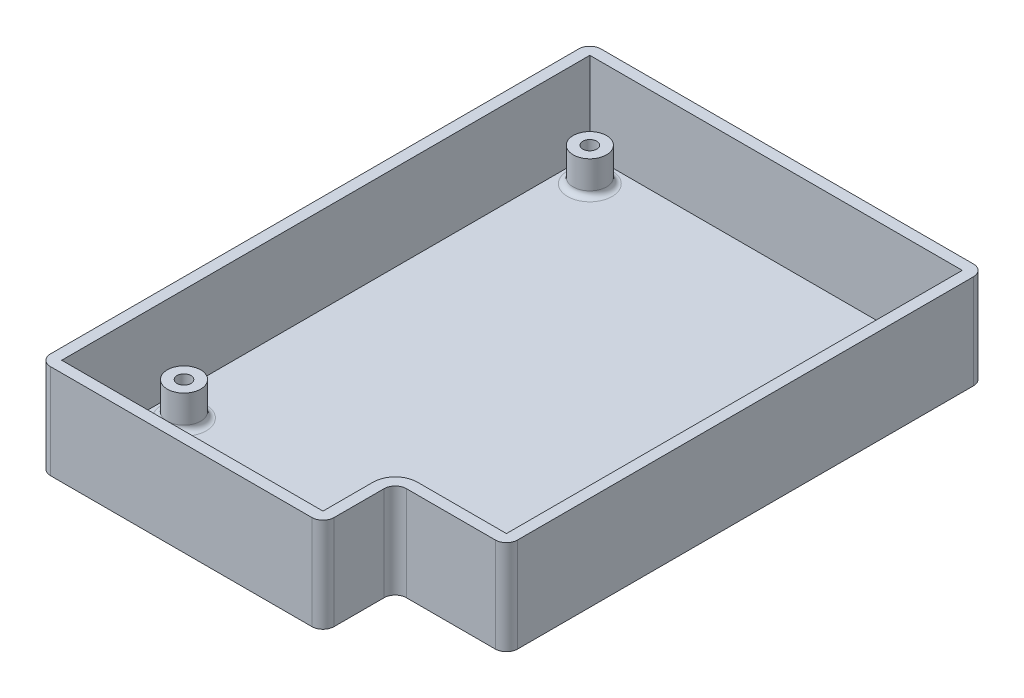
ISO-10303-21;
HEADER;
FILE_DESCRIPTION(('STEP AP214'),'2;1');
FILE_NAME('part.step','',(''),(''),'','','');
FILE_SCHEMA(('AUTOMOTIVE_DESIGN { 1 0 10303 214 1 1 1 1 }'));
ENDSEC;
DATA;
#1=APPLICATION_CONTEXT('core data for automotive mechanical design processes');
#2=APPLICATION_PROTOCOL_DEFINITION('international standard','automotive_design',2000,#1);
#3=PRODUCT_CONTEXT('',#1,'mechanical');
#4=PRODUCT('Part','Part','',(#3));
#5=PRODUCT_RELATED_PRODUCT_CATEGORY('part','',(#4));
#6=PRODUCT_DEFINITION_FORMATION('','',#4);
#7=PRODUCT_DEFINITION_CONTEXT('part definition',#1,'design');
#8=PRODUCT_DEFINITION('design','',#6,#7);
#9=PRODUCT_DEFINITION_SHAPE('','',#8);
#10=(LENGTH_UNIT() NAMED_UNIT(*) SI_UNIT(.MILLI.,.METRE.));
#11=(NAMED_UNIT(*) PLANE_ANGLE_UNIT() SI_UNIT($,.RADIAN.));
#12=(NAMED_UNIT(*) SI_UNIT($,.STERADIAN.) SOLID_ANGLE_UNIT());
#13=UNCERTAINTY_MEASURE_WITH_UNIT(LENGTH_MEASURE(1.E-05),#10,'distance_accuracy_value','');
#14=(GEOMETRIC_REPRESENTATION_CONTEXT(3) GLOBAL_UNCERTAINTY_ASSIGNED_CONTEXT((#13)) GLOBAL_UNIT_ASSIGNED_CONTEXT((#10,
#11,#12)) REPRESENTATION_CONTEXT('',''));
#15=CARTESIAN_POINT('',(0.,0.,0.));
#16=DIRECTION('',(0.,0.,1.));
#17=DIRECTION('',(1.,0.,0.));
#18=AXIS2_PLACEMENT_3D('',#15,#16,#17);
#19=CARTESIAN_POINT('',(0.,1.5,0.));
#20=DIRECTION('',(0.,1.,0.));
#21=DIRECTION('',(0.,0.,1.));
#22=AXIS2_PLACEMENT_3D('',#19,#20,#21);
#23=PLANE('',#22);
#24=DIRECTION('',(-1.,0.,0.));
#25=VECTOR('',#24,1.);
#26=CARTESIAN_POINT('',(33.5,1.5,-41.));
#27=LINE('',#26,#25);
#28=CARTESIAN_POINT('',(33.5,1.5,-41.));
#29=VERTEX_POINT('',#28);
#30=CARTESIAN_POINT('',(-33.5,1.5,-41.));
#31=VERTEX_POINT('',#30);
#32=EDGE_CURVE('E203',#29,#31,#27,.T.);
#33=ORIENTED_EDGE('',*,*,#32,.T.);
#34=DIRECTION('',(0.,0.,1.));
#35=VECTOR('',#34,1.);
#36=CARTESIAN_POINT('',(-33.5,1.5,-41.));
#37=LINE('',#36,#35);
#38=CARTESIAN_POINT('',(-33.5,1.5,54.));
#39=VERTEX_POINT('',#38);
#40=EDGE_CURVE('E185',#31,#39,#37,.T.);
#41=ORIENTED_EDGE('',*,*,#40,.T.);
#42=DIRECTION('',(1.,0.,0.));
#43=VECTOR('',#42,1.);
#44=CARTESIAN_POINT('',(-33.5,1.5,54.));
#45=LINE('',#44,#43);
#46=CARTESIAN_POINT('',(13.5,1.5,54.));
#47=VERTEX_POINT('',#46);
#48=EDGE_CURVE('E206',#39,#47,#45,.T.);
#49=ORIENTED_EDGE('',*,*,#48,.T.);
#50=DIRECTION('',(0.,0.,-1.));
#51=VECTOR('',#50,1.);
#52=CARTESIAN_POINT('',(13.5,1.5,54.));
#53=LINE('',#52,#51);
#54=CARTESIAN_POINT('',(13.5,1.5,45.));
#55=VERTEX_POINT('',#54);
#56=EDGE_CURVE('E208',#47,#55,#53,.T.);
#57=ORIENTED_EDGE('',*,*,#56,.T.);
#58=CARTESIAN_POINT('',(17.5,1.5,45.));
#59=DIRECTION('',(0.,1.,0.));
#60=DIRECTION('',(0.,0.,1.));
#61=AXIS2_PLACEMENT_3D('',#58,#59,#60);
#62=CIRCLE('',#61,4.);
#63=CARTESIAN_POINT('',(17.5,1.5,41.));
#64=VERTEX_POINT('',#63);
#65=EDGE_CURVE('E11',#55,#64,#62,.F.);
#66=ORIENTED_EDGE('',*,*,#65,.T.);
#67=DIRECTION('',(1.,0.,0.));
#68=VECTOR('',#67,1.);
#69=CARTESIAN_POINT('',(13.5,1.5,41.));
#70=LINE('',#69,#68);
#71=CARTESIAN_POINT('',(33.5,1.5,41.));
#72=VERTEX_POINT('',#71);
#73=EDGE_CURVE('E210',#64,#72,#70,.T.);
#74=ORIENTED_EDGE('',*,*,#73,.T.);
#75=DIRECTION('',(0.,0.,-1.));
#76=VECTOR('',#75,1.);
#77=CARTESIAN_POINT('',(33.5,1.5,41.));
#78=LINE('',#77,#76);
#79=EDGE_CURVE('E178',#72,#29,#78,.T.);
#80=ORIENTED_EDGE('',*,*,#79,.T.);
#81=EDGE_LOOP('',(#33,#41,#49,#57,#66,#74,#80));
#82=FACE_BOUND('',#81,.T.);
#83=CARTESIAN_POINT('',(-29.,1.5,36.5));
#84=DIRECTION('',(0.,1.,0.));
#85=DIRECTION('',(0.,0.,1.));
#86=AXIS2_PLACEMENT_3D('',#83,#84,#85);
#87=CIRCLE('',#86,4.);
#88=CARTESIAN_POINT('',(-29.,1.5,40.5));
#89=VERTEX_POINT('',#88);
#90=EDGE_CURVE('E304',#89,#89,#87,.F.);
#91=ORIENTED_EDGE('',*,*,#90,.T.);
#92=EDGE_LOOP('',(#91));
#93=FACE_BOUND('',#92,.T.);
#94=CARTESIAN_POINT('',(29.,1.5,36.5));
#95=DIRECTION('',(0.,1.,0.));
#96=DIRECTION('',(0.,0.,1.));
#97=AXIS2_PLACEMENT_3D('',#94,#95,#96);
#98=CIRCLE('',#97,4.);
#99=CARTESIAN_POINT('',(29.,1.5,40.5));
#100=VERTEX_POINT('',#99);
#101=EDGE_CURVE('E301',#100,#100,#98,.F.);
#102=ORIENTED_EDGE('',*,*,#101,.T.);
#103=EDGE_LOOP('',(#102));
#104=FACE_BOUND('',#103,.T.);
#105=CARTESIAN_POINT('',(29.,1.5,-36.5));
#106=DIRECTION('',(0.,1.,0.));
#107=DIRECTION('',(0.,0.,1.));
#108=AXIS2_PLACEMENT_3D('',#105,#106,#107);
#109=CIRCLE('',#108,4.);
#110=CARTESIAN_POINT('',(29.,1.5,-32.5));
#111=VERTEX_POINT('',#110);
#112=EDGE_CURVE('E298',#111,#111,#109,.F.);
#113=ORIENTED_EDGE('',*,*,#112,.T.);
#114=EDGE_LOOP('',(#113));
#115=FACE_BOUND('',#114,.T.);
#116=CARTESIAN_POINT('',(-29.,1.5,-36.5));
#117=DIRECTION('',(0.,1.,0.));
#118=DIRECTION('',(0.,0.,1.));
#119=AXIS2_PLACEMENT_3D('',#116,#117,#118);
#120=CIRCLE('',#119,4.);
#121=CARTESIAN_POINT('',(-29.,1.5,-32.5));
#122=VERTEX_POINT('',#121);
#123=EDGE_CURVE('E295',#122,#122,#120,.F.);
#124=ORIENTED_EDGE('',*,*,#123,.T.);
#125=EDGE_LOOP('',(#124));
#126=FACE_BOUND('',#125,.T.);
#127=ADVANCED_FACE('F37',(#82,#93,#104,#115,#126),#23,.T.);
#128=CARTESIAN_POINT('',(-29.,7.5,-36.5));
#129=DIRECTION('',(0.,1.,0.));
#130=DIRECTION('',(0.,0.,1.));
#131=AXIS2_PLACEMENT_3D('',#128,#129,#130);
#132=PLANE('',#131);
#133=CARTESIAN_POINT('',(-29.,7.5,-36.5));
#134=DIRECTION('',(0.,1.,0.));
#135=DIRECTION('',(0.,0.,1.));
#136=AXIS2_PLACEMENT_3D('',#133,#134,#135);
#137=CIRCLE('',#136,3.);
#138=CARTESIAN_POINT('',(-29.,7.5,-33.5));
#139=VERTEX_POINT('',#138);
#140=EDGE_CURVE('E259',#139,#139,#137,.T.);
#141=ORIENTED_EDGE('',*,*,#140,.T.);
#142=EDGE_LOOP('',(#141));
#143=FACE_BOUND('',#142,.T.);
#144=CARTESIAN_POINT('',(-29.,7.5,-36.5));
#145=DIRECTION('',(0.,1.,0.));
#146=DIRECTION('',(0.,0.,1.));
#147=AXIS2_PLACEMENT_3D('',#144,#145,#146);
#148=CIRCLE('',#147,1.25);
#149=CARTESIAN_POINT('',(-29.,7.5,-35.25));
#150=VERTEX_POINT('',#149);
#151=EDGE_CURVE('E256',#150,#150,#148,.T.);
#152=ORIENTED_EDGE('',*,*,#151,.F.);
#153=EDGE_LOOP('',(#152));
#154=FACE_BOUND('',#153,.T.);
#155=ADVANCED_FACE('F388',(#143,#154),#132,.T.);
#156=CARTESIAN_POINT('',(-29.,7.5,-36.5));
#157=DIRECTION('',(0.,-1.,0.));
#158=DIRECTION('',(0.,0.,-1.));
#159=AXIS2_PLACEMENT_3D('',#156,#157,#158);
#160=CYLINDRICAL_SURFACE('',#159,3.);
#161=CARTESIAN_POINT('',(-29.,2.5,-36.5));
#162=DIRECTION('',(0.,1.,0.));
#163=DIRECTION('',(0.,0.,1.));
#164=AXIS2_PLACEMENT_3D('',#161,#162,#163);
#165=CIRCLE('',#164,3.);
#166=CARTESIAN_POINT('',(-29.,2.5,-33.5));
#167=VERTEX_POINT('',#166);
#168=EDGE_CURVE('E313',#167,#167,#165,.T.);
#169=ORIENTED_EDGE('',*,*,#168,.T.);
#170=EDGE_LOOP('',(#169));
#171=FACE_BOUND('',#170,.T.);
#172=ORIENTED_EDGE('',*,*,#140,.F.);
#173=EDGE_LOOP('',(#172));
#174=FACE_BOUND('',#173,.T.);
#175=ADVANCED_FACE('F395',(#171,#174),#160,.T.);
#176=CARTESIAN_POINT('',(-29.,7.5,-36.5));
#177=DIRECTION('',(0.,-1.,0.));
#178=DIRECTION('',(0.,0.,-1.));
#179=AXIS2_PLACEMENT_3D('',#176,#177,#178);
#180=CYLINDRICAL_SURFACE('',#179,1.25);
#181=ORIENTED_EDGE('',*,*,#151,.T.);
#182=EDGE_LOOP('',(#181));
#183=FACE_BOUND('',#182,.T.);
#184=CARTESIAN_POINT('',(-29.,1.5,-36.5));
#185=DIRECTION('',(0.,1.,0.));
#186=DIRECTION('',(0.,0.,1.));
#187=AXIS2_PLACEMENT_3D('',#184,#185,#186);
#188=CIRCLE('',#187,1.25);
#189=CARTESIAN_POINT('',(-29.,1.5,-35.25));
#190=VERTEX_POINT('',#189);
#191=EDGE_CURVE('E280',#190,#190,#188,.F.);
#192=ORIENTED_EDGE('',*,*,#191,.T.);
#193=EDGE_LOOP('',(#192));
#194=FACE_BOUND('',#193,.T.);
#195=ADVANCED_FACE('F408',(#183,#194),#180,.F.);
#196=ORIENTED_EDGE('',*,*,#191,.F.);
#197=EDGE_LOOP('',(#196));
#198=FACE_BOUND('',#197,.T.);
#199=ADVANCED_FACE('F391',(#198),#23,.T.);
#200=CARTESIAN_POINT('',(29.,7.5,-36.5));
#201=DIRECTION('',(0.,-1.,0.));
#202=DIRECTION('',(0.,0.,-1.));
#203=AXIS2_PLACEMENT_3D('',#200,#201,#202);
#204=PLANE('',#203);
#205=CARTESIAN_POINT('',(29.,7.5,-36.5));
#206=DIRECTION('',(0.,1.,0.));
#207=DIRECTION('',(0.,0.,-1.));
#208=AXIS2_PLACEMENT_3D('',#205,#206,#207);
#209=CIRCLE('',#208,3.);
#210=CARTESIAN_POINT('',(29.,7.5,-39.5));
#211=VERTEX_POINT('',#210);
#212=EDGE_CURVE('E253',#211,#211,#209,.T.);
#213=ORIENTED_EDGE('',*,*,#212,.T.);
#214=EDGE_LOOP('',(#213));
#215=FACE_BOUND('',#214,.T.);
#216=CARTESIAN_POINT('',(29.,7.5,-36.5));
#217=DIRECTION('',(0.,1.,0.));
#218=DIRECTION('',(0.,0.,-1.));
#219=AXIS2_PLACEMENT_3D('',#216,#217,#218);
#220=CIRCLE('',#219,1.25);
#221=CARTESIAN_POINT('',(29.,7.5,-37.75));
#222=VERTEX_POINT('',#221);
#223=EDGE_CURVE('E250',#222,#222,#220,.T.);
#224=ORIENTED_EDGE('',*,*,#223,.F.);
#225=EDGE_LOOP('',(#224));
#226=FACE_BOUND('',#225,.T.);
#227=ADVANCED_FACE('F407',(#215,#226),#204,.F.);
#228=CARTESIAN_POINT('',(29.,7.5,-36.5));
#229=DIRECTION('',(0.,-1.,0.));
#230=DIRECTION('',(0.,0.,-1.));
#231=AXIS2_PLACEMENT_3D('',#228,#229,#230);
#232=CYLINDRICAL_SURFACE('',#231,3.);
#233=CARTESIAN_POINT('',(29.,2.5,-36.5));
#234=DIRECTION('',(0.,1.,0.));
#235=DIRECTION('',(0.,0.,1.));
#236=AXIS2_PLACEMENT_3D('',#233,#234,#235);
#237=CIRCLE('',#236,3.);
#238=CARTESIAN_POINT('',(29.,2.5,-33.5));
#239=VERTEX_POINT('',#238);
#240=EDGE_CURVE('E310',#239,#239,#237,.T.);
#241=ORIENTED_EDGE('',*,*,#240,.T.);
#242=EDGE_LOOP('',(#241));
#243=FACE_BOUND('',#242,.T.);
#244=ORIENTED_EDGE('',*,*,#212,.F.);
#245=EDGE_LOOP('',(#244));
#246=FACE_BOUND('',#245,.T.);
#247=ADVANCED_FACE('F415',(#243,#246),#232,.T.);
#248=CARTESIAN_POINT('',(29.,7.5,-36.5));
#249=DIRECTION('',(0.,-1.,0.));
#250=DIRECTION('',(0.,0.,-1.));
#251=AXIS2_PLACEMENT_3D('',#248,#249,#250);
#252=CYLINDRICAL_SURFACE('',#251,1.25);
#253=ORIENTED_EDGE('',*,*,#223,.T.);
#254=EDGE_LOOP('',(#253));
#255=FACE_BOUND('',#254,.T.);
#256=CARTESIAN_POINT('',(29.,1.5,-36.5));
#257=DIRECTION('',(0.,1.,0.));
#258=DIRECTION('',(0.,0.,1.));
#259=AXIS2_PLACEMENT_3D('',#256,#257,#258);
#260=CIRCLE('',#259,1.25);
#261=CARTESIAN_POINT('',(29.,1.5,-35.25));
#262=VERTEX_POINT('',#261);
#263=EDGE_CURVE('E283',#262,#262,#260,.F.);
#264=ORIENTED_EDGE('',*,*,#263,.T.);
#265=EDGE_LOOP('',(#264));
#266=FACE_BOUND('',#265,.T.);
#267=ADVANCED_FACE('F423',(#255,#266),#252,.F.);
#268=ORIENTED_EDGE('',*,*,#263,.F.);
#269=EDGE_LOOP('',(#268));
#270=FACE_BOUND('',#269,.T.);
#271=ADVANCED_FACE('F410',(#270),#23,.T.);
#272=CARTESIAN_POINT('',(29.,7.5,36.5));
#273=DIRECTION('',(0.,1.,0.));
#274=DIRECTION('',(0.,0.,1.));
#275=AXIS2_PLACEMENT_3D('',#272,#273,#274);
#276=PLANE('',#275);
#277=CARTESIAN_POINT('',(29.,7.5,36.5));
#278=DIRECTION('',(0.,1.,0.));
#279=DIRECTION('',(0.,0.,1.));
#280=AXIS2_PLACEMENT_3D('',#277,#278,#279);
#281=CIRCLE('',#280,3.);
#282=CARTESIAN_POINT('',(29.,7.5,39.5));
#283=VERTEX_POINT('',#282);
#284=EDGE_CURVE('E247',#283,#283,#281,.T.);
#285=ORIENTED_EDGE('',*,*,#284,.T.);
#286=EDGE_LOOP('',(#285));
#287=FACE_BOUND('',#286,.T.);
#288=CARTESIAN_POINT('',(29.,7.5,36.5));
#289=DIRECTION('',(0.,1.,0.));
#290=DIRECTION('',(0.,0.,1.));
#291=AXIS2_PLACEMENT_3D('',#288,#289,#290);
#292=CIRCLE('',#291,1.25);
#293=CARTESIAN_POINT('',(29.,7.5,37.75));
#294=VERTEX_POINT('',#293);
#295=EDGE_CURVE('E244',#294,#294,#292,.T.);
#296=ORIENTED_EDGE('',*,*,#295,.F.);
#297=EDGE_LOOP('',(#296));
#298=FACE_BOUND('',#297,.T.);
#299=ADVANCED_FACE('F422',(#287,#298),#276,.T.);
#300=CARTESIAN_POINT('',(29.,7.5,36.5));
#301=DIRECTION('',(0.,-1.,0.));
#302=DIRECTION('',(0.,0.,-1.));
#303=AXIS2_PLACEMENT_3D('',#300,#301,#302);
#304=CYLINDRICAL_SURFACE('',#303,3.);
#305=CARTESIAN_POINT('',(29.,2.5,36.5));
#306=DIRECTION('',(0.,1.,0.));
#307=DIRECTION('',(0.,0.,1.));
#308=AXIS2_PLACEMENT_3D('',#305,#306,#307);
#309=CIRCLE('',#308,3.);
#310=CARTESIAN_POINT('',(29.,2.5,39.5));
#311=VERTEX_POINT('',#310);
#312=EDGE_CURVE('E307',#311,#311,#309,.T.);
#313=ORIENTED_EDGE('',*,*,#312,.T.);
#314=EDGE_LOOP('',(#313));
#315=FACE_BOUND('',#314,.T.);
#316=ORIENTED_EDGE('',*,*,#284,.F.);
#317=EDGE_LOOP('',(#316));
#318=FACE_BOUND('',#317,.T.);
#319=ADVANCED_FACE('F429',(#315,#318),#304,.T.);
#320=CARTESIAN_POINT('',(29.,7.5,36.5));
#321=DIRECTION('',(0.,-1.,0.));
#322=DIRECTION('',(0.,0.,-1.));
#323=AXIS2_PLACEMENT_3D('',#320,#321,#322);
#324=CYLINDRICAL_SURFACE('',#323,1.25);
#325=ORIENTED_EDGE('',*,*,#295,.T.);
#326=EDGE_LOOP('',(#325));
#327=FACE_BOUND('',#326,.T.);
#328=CARTESIAN_POINT('',(29.,1.5,36.5));
#329=DIRECTION('',(0.,1.,0.));
#330=DIRECTION('',(0.,0.,1.));
#331=AXIS2_PLACEMENT_3D('',#328,#329,#330);
#332=CIRCLE('',#331,1.25);
#333=CARTESIAN_POINT('',(29.,1.5,37.75));
#334=VERTEX_POINT('',#333);
#335=EDGE_CURVE('E286',#334,#334,#332,.F.);
#336=ORIENTED_EDGE('',*,*,#335,.T.);
#337=EDGE_LOOP('',(#336));
#338=FACE_BOUND('',#337,.T.);
#339=ADVANCED_FACE('F437',(#327,#338),#324,.F.);
#340=ORIENTED_EDGE('',*,*,#335,.F.);
#341=EDGE_LOOP('',(#340));
#342=FACE_BOUND('',#341,.T.);
#343=ADVANCED_FACE('F405',(#342),#23,.T.);
#344=CARTESIAN_POINT('',(-29.,7.5,36.5));
#345=DIRECTION('',(0.,-1.,0.));
#346=DIRECTION('',(0.,0.,-1.));
#347=AXIS2_PLACEMENT_3D('',#344,#345,#346);
#348=PLANE('',#347);
#349=CARTESIAN_POINT('',(-29.,7.5,36.5));
#350=DIRECTION('',(0.,1.,0.));
#351=DIRECTION('',(0.,0.,-1.));
#352=AXIS2_PLACEMENT_3D('',#349,#350,#351);
#353=CIRCLE('',#352,3.);
#354=CARTESIAN_POINT('',(-29.,7.5,33.5));
#355=VERTEX_POINT('',#354);
#356=EDGE_CURVE('E241',#355,#355,#353,.T.);
#357=ORIENTED_EDGE('',*,*,#356,.T.);
#358=EDGE_LOOP('',(#357));
#359=FACE_BOUND('',#358,.T.);
#360=CARTESIAN_POINT('',(-29.,7.5,36.5));
#361=DIRECTION('',(0.,1.,0.));
#362=DIRECTION('',(0.,0.,-1.));
#363=AXIS2_PLACEMENT_3D('',#360,#361,#362);
#364=CIRCLE('',#363,1.25);
#365=CARTESIAN_POINT('',(-29.,7.5,35.25));
#366=VERTEX_POINT('',#365);
#367=EDGE_CURVE('E238',#366,#366,#364,.T.);
#368=ORIENTED_EDGE('',*,*,#367,.F.);
#369=EDGE_LOOP('',(#368));
#370=FACE_BOUND('',#369,.T.);
#371=ADVANCED_FACE('F436',(#359,#370),#348,.F.);
#372=CARTESIAN_POINT('',(-29.,7.5,36.5));
#373=DIRECTION('',(0.,-1.,0.));
#374=DIRECTION('',(0.,0.,-1.));
#375=AXIS2_PLACEMENT_3D('',#372,#373,#374);
#376=CYLINDRICAL_SURFACE('',#375,3.);
#377=CARTESIAN_POINT('',(-29.,2.5,36.5));
#378=DIRECTION('',(0.,1.,0.));
#379=DIRECTION('',(0.,0.,1.));
#380=AXIS2_PLACEMENT_3D('',#377,#378,#379);
#381=CIRCLE('',#380,3.);
#382=CARTESIAN_POINT('',(-29.,2.5,39.5));
#383=VERTEX_POINT('',#382);
#384=EDGE_CURVE('E292',#383,#383,#381,.T.);
#385=ORIENTED_EDGE('',*,*,#384,.T.);
#386=EDGE_LOOP('',(#385));
#387=FACE_BOUND('',#386,.T.);
#388=ORIENTED_EDGE('',*,*,#356,.F.);
#389=EDGE_LOOP('',(#388));
#390=FACE_BOUND('',#389,.T.);
#391=ADVANCED_FACE('F443',(#387,#390),#376,.T.);
#392=CARTESIAN_POINT('',(-29.,7.5,36.5));
#393=DIRECTION('',(0.,-1.,0.));
#394=DIRECTION('',(0.,0.,-1.));
#395=AXIS2_PLACEMENT_3D('',#392,#393,#394);
#396=CYLINDRICAL_SURFACE('',#395,1.25);
#397=ORIENTED_EDGE('',*,*,#367,.T.);
#398=EDGE_LOOP('',(#397));
#399=FACE_BOUND('',#398,.T.);
#400=CARTESIAN_POINT('',(-29.,1.5,36.5));
#401=DIRECTION('',(0.,1.,0.));
#402=DIRECTION('',(0.,0.,1.));
#403=AXIS2_PLACEMENT_3D('',#400,#401,#402);
#404=CIRCLE('',#403,1.25);
#405=CARTESIAN_POINT('',(-29.,1.5,37.75));
#406=VERTEX_POINT('',#405);
#407=EDGE_CURVE('E289',#406,#406,#404,.F.);
#408=ORIENTED_EDGE('',*,*,#407,.T.);
#409=EDGE_LOOP('',(#408));
#410=FACE_BOUND('',#409,.T.);
#411=ADVANCED_FACE('F403',(#399,#410),#396,.F.);
#412=ORIENTED_EDGE('',*,*,#407,.F.);
#413=EDGE_LOOP('',(#412));
#414=FACE_BOUND('',#413,.T.);
#415=ADVANCED_FACE('F390',(#414),#23,.T.);
#416=CARTESIAN_POINT('',(-29.,2.5,36.5));
#417=DIRECTION('',(0.,1.,0.));
#418=DIRECTION('',(0.,0.,1.));
#419=AXIS2_PLACEMENT_3D('',#416,#417,#418);
#420=TOROIDAL_SURFACE('',#419,4.,1.);
#421=ORIENTED_EDGE('',*,*,#90,.F.);
#422=EDGE_LOOP('',(#421));
#423=FACE_BOUND('',#422,.T.);
#424=ORIENTED_EDGE('',*,*,#384,.F.);
#425=EDGE_LOOP('',(#424));
#426=FACE_BOUND('',#425,.T.);
#427=ADVANCED_FACE('F402',(#423,#426),#420,.F.);
#428=CARTESIAN_POINT('',(29.,2.5,36.5));
#429=DIRECTION('',(0.,1.,0.));
#430=DIRECTION('',(0.,0.,1.));
#431=AXIS2_PLACEMENT_3D('',#428,#429,#430);
#432=TOROIDAL_SURFACE('',#431,4.,1.);
#433=ORIENTED_EDGE('',*,*,#101,.F.);
#434=EDGE_LOOP('',(#433));
#435=FACE_BOUND('',#434,.T.);
#436=ORIENTED_EDGE('',*,*,#312,.F.);
#437=EDGE_LOOP('',(#436));
#438=FACE_BOUND('',#437,.T.);
#439=ADVANCED_FACE('F481',(#435,#438),#432,.F.);
#440=CARTESIAN_POINT('',(29.,2.5,-36.5));
#441=DIRECTION('',(0.,1.,0.));
#442=DIRECTION('',(0.,0.,1.));
#443=AXIS2_PLACEMENT_3D('',#440,#441,#442);
#444=TOROIDAL_SURFACE('',#443,4.,1.);
#445=ORIENTED_EDGE('',*,*,#112,.F.);
#446=EDGE_LOOP('',(#445));
#447=FACE_BOUND('',#446,.T.);
#448=ORIENTED_EDGE('',*,*,#240,.F.);
#449=EDGE_LOOP('',(#448));
#450=FACE_BOUND('',#449,.T.);
#451=ADVANCED_FACE('F472',(#447,#450),#444,.F.);
#452=CARTESIAN_POINT('',(-29.,2.5,-36.5));
#453=DIRECTION('',(0.,1.,0.));
#454=DIRECTION('',(0.,0.,1.));
#455=AXIS2_PLACEMENT_3D('',#452,#453,#454);
#456=TOROIDAL_SURFACE('',#455,4.,1.);
#457=ORIENTED_EDGE('',*,*,#123,.F.);
#458=EDGE_LOOP('',(#457));
#459=FACE_BOUND('',#458,.T.);
#460=ORIENTED_EDGE('',*,*,#168,.F.);
#461=EDGE_LOOP('',(#460));
#462=FACE_BOUND('',#461,.T.);
#463=ADVANCED_FACE('F470',(#459,#462),#456,.F.);
#464=CARTESIAN_POINT('',(0.,17.,0.));
#465=DIRECTION('',(0.,1.,0.));
#466=DIRECTION('',(0.,0.,1.));
#467=AXIS2_PLACEMENT_3D('',#464,#465,#466);
#468=PLANE('',#467);
#469=DIRECTION('',(0.,0.,-1.));
#470=VECTOR('',#469,1.);
#471=CARTESIAN_POINT('',(35.5,17.,43.));
#472=LINE('',#471,#470);
#473=CARTESIAN_POINT('',(35.5,17.,41.));
#474=VERTEX_POINT('',#473);
#475=CARTESIAN_POINT('',(35.5,17.,-41.));
#476=VERTEX_POINT('',#475);
#477=EDGE_CURVE('E235',#474,#476,#472,.T.);
#478=ORIENTED_EDGE('',*,*,#477,.T.);
#479=CARTESIAN_POINT('',(33.5,17.,-41.));
#480=DIRECTION('',(0.,1.,0.));
#481=DIRECTION('',(0.,0.,1.));
#482=AXIS2_PLACEMENT_3D('',#479,#480,#481);
#483=CIRCLE('',#482,2.);
#484=CARTESIAN_POINT('',(33.5,17.,-43.));
#485=VERTEX_POINT('',#484);
#486=EDGE_CURVE('E344',#476,#485,#483,.T.);
#487=ORIENTED_EDGE('',*,*,#486,.T.);
#488=DIRECTION('',(-1.,0.,0.));
#489=VECTOR('',#488,1.);
#490=CARTESIAN_POINT('',(35.5,17.,-43.));
#491=LINE('',#490,#489);
#492=CARTESIAN_POINT('',(-33.5,17.,-43.));
#493=VERTEX_POINT('',#492);
#494=EDGE_CURVE('E186',#485,#493,#491,.T.);
#495=ORIENTED_EDGE('',*,*,#494,.T.);
#496=CARTESIAN_POINT('',(-33.5,17.,-41.));
#497=DIRECTION('',(0.,1.,0.));
#498=DIRECTION('',(0.,0.,1.));
#499=AXIS2_PLACEMENT_3D('',#496,#497,#498);
#500=CIRCLE('',#499,2.);
#501=CARTESIAN_POINT('',(-35.5,17.,-41.));
#502=VERTEX_POINT('',#501);
#503=EDGE_CURVE('E342',#493,#502,#500,.T.);
#504=ORIENTED_EDGE('',*,*,#503,.T.);
#505=DIRECTION('',(0.,0.,1.));
#506=VECTOR('',#505,1.);
#507=CARTESIAN_POINT('',(-35.5,17.,-43.));
#508=LINE('',#507,#506);
#509=CARTESIAN_POINT('',(-35.5,17.,54.));
#510=VERTEX_POINT('',#509);
#511=EDGE_CURVE('E223',#502,#510,#508,.T.);
#512=ORIENTED_EDGE('',*,*,#511,.T.);
#513=CARTESIAN_POINT('',(-33.5,17.,54.));
#514=DIRECTION('',(0.,1.,0.));
#515=DIRECTION('',(0.,0.,1.));
#516=AXIS2_PLACEMENT_3D('',#513,#514,#515);
#517=CIRCLE('',#516,2.);
#518=CARTESIAN_POINT('',(-33.5,17.,56.));
#519=VERTEX_POINT('',#518);
#520=EDGE_CURVE('E338',#510,#519,#517,.T.);
#521=ORIENTED_EDGE('',*,*,#520,.T.);
#522=DIRECTION('',(1.,0.,0.));
#523=VECTOR('',#522,1.);
#524=CARTESIAN_POINT('',(-35.5,17.,56.));
#525=LINE('',#524,#523);
#526=CARTESIAN_POINT('',(13.5,17.,56.));
#527=VERTEX_POINT('',#526);
#528=EDGE_CURVE('E226',#519,#527,#525,.T.);
#529=ORIENTED_EDGE('',*,*,#528,.T.);
#530=CARTESIAN_POINT('',(13.5,17.,54.));
#531=DIRECTION('',(0.,1.,0.));
#532=DIRECTION('',(0.,0.,1.));
#533=AXIS2_PLACEMENT_3D('',#530,#531,#532);
#534=CIRCLE('',#533,2.);
#535=CARTESIAN_POINT('',(15.5,17.,54.));
#536=VERTEX_POINT('',#535);
#537=EDGE_CURVE('E336',#527,#536,#534,.T.);
#538=ORIENTED_EDGE('',*,*,#537,.T.);
#539=DIRECTION('',(0.,0.,-1.));
#540=VECTOR('',#539,1.);
#541=CARTESIAN_POINT('',(15.5,17.,56.));
#542=LINE('',#541,#540);
#543=CARTESIAN_POINT('',(15.5,17.,45.));
#544=VERTEX_POINT('',#543);
#545=EDGE_CURVE('E229',#536,#544,#542,.T.);
#546=ORIENTED_EDGE('',*,*,#545,.T.);
#547=CARTESIAN_POINT('',(17.5,17.,45.));
#548=DIRECTION('',(0.,1.,0.));
#549=DIRECTION('',(0.,0.,1.));
#550=AXIS2_PLACEMENT_3D('',#547,#548,#549);
#551=CIRCLE('',#550,2.);
#552=CARTESIAN_POINT('',(17.5,17.,43.));
#553=VERTEX_POINT('',#552);
#554=EDGE_CURVE('E368',#544,#553,#551,.F.);
#555=ORIENTED_EDGE('',*,*,#554,.T.);
#556=DIRECTION('',(1.,0.,0.));
#557=VECTOR('',#556,1.);
#558=CARTESIAN_POINT('',(15.5,17.,43.));
#559=LINE('',#558,#557);
#560=CARTESIAN_POINT('',(33.5,17.,43.));
#561=VERTEX_POINT('',#560);
#562=EDGE_CURVE('E232',#553,#561,#559,.T.);
#563=ORIENTED_EDGE('',*,*,#562,.T.);
#564=CARTESIAN_POINT('',(33.5,17.,41.));
#565=DIRECTION('',(0.,1.,0.));
#566=DIRECTION('',(0.,0.,1.));
#567=AXIS2_PLACEMENT_3D('',#564,#565,#566);
#568=CIRCLE('',#567,2.);
#569=EDGE_CURVE('E340',#561,#474,#568,.T.);
#570=ORIENTED_EDGE('',*,*,#569,.T.);
#571=EDGE_LOOP('',(#478,#487,#495,#504,#512,#521,#529,#538,#546,#555,#563,#570));
#572=FACE_BOUND('',#571,.T.);
#573=DIRECTION('',(1.,0.,0.));
#574=VECTOR('',#573,1.);
#575=CARTESIAN_POINT('',(13.5,17.,41.));
#576=LINE('',#575,#574);
#577=CARTESIAN_POINT('',(17.5,17.,41.));
#578=VERTEX_POINT('',#577);
#579=CARTESIAN_POINT('',(33.5,17.,41.));
#580=VERTEX_POINT('',#579);
#581=EDGE_CURVE('E199',#578,#580,#576,.T.);
#582=ORIENTED_EDGE('',*,*,#581,.F.);
#583=CARTESIAN_POINT('',(17.5,17.,45.));
#584=DIRECTION('',(0.,1.,0.));
#585=DIRECTION('',(0.,0.,1.));
#586=AXIS2_PLACEMENT_3D('',#583,#584,#585);
#587=CIRCLE('',#586,4.);
#588=CARTESIAN_POINT('',(13.5,17.,45.));
#589=VERTEX_POINT('',#588);
#590=EDGE_CURVE('E45',#578,#589,#587,.T.);
#591=ORIENTED_EDGE('',*,*,#590,.T.);
#592=DIRECTION('',(0.,0.,-1.));
#593=VECTOR('',#592,1.);
#594=CARTESIAN_POINT('',(13.5,17.,54.));
#595=LINE('',#594,#593);
#596=CARTESIAN_POINT('',(13.5,17.,54.));
#597=VERTEX_POINT('',#596);
#598=EDGE_CURVE('E194',#597,#589,#595,.T.);
#599=ORIENTED_EDGE('',*,*,#598,.F.);
#600=DIRECTION('',(1.,0.,0.));
#601=VECTOR('',#600,1.);
#602=CARTESIAN_POINT('',(-33.5,17.,54.));
#603=LINE('',#602,#601);
#604=CARTESIAN_POINT('',(-33.5,17.,54.));
#605=VERTEX_POINT('',#604);
#606=EDGE_CURVE('E192',#605,#597,#603,.T.);
#607=ORIENTED_EDGE('',*,*,#606,.F.);
#608=DIRECTION('',(0.,0.,1.));
#609=VECTOR('',#608,1.);
#610=CARTESIAN_POINT('',(-33.5,17.,-41.));
#611=LINE('',#610,#609);
#612=CARTESIAN_POINT('',(-33.5,17.,-41.));
#613=VERTEX_POINT('',#612);
#614=EDGE_CURVE('E177',#613,#605,#611,.T.);
#615=ORIENTED_EDGE('',*,*,#614,.F.);
#616=DIRECTION('',(-1.,0.,0.));
#617=VECTOR('',#616,1.);
#618=CARTESIAN_POINT('',(33.5,17.,-41.));
#619=LINE('',#618,#617);
#620=CARTESIAN_POINT('',(33.5,17.,-41.));
#621=VERTEX_POINT('',#620);
#622=EDGE_CURVE('E167',#621,#613,#619,.T.);
#623=ORIENTED_EDGE('',*,*,#622,.F.);
#624=DIRECTION('',(0.,0.,-1.));
#625=VECTOR('',#624,1.);
#626=CARTESIAN_POINT('',(33.5,17.,41.));
#627=LINE('',#626,#625);
#628=EDGE_CURVE('E201',#580,#621,#627,.T.);
#629=ORIENTED_EDGE('',*,*,#628,.F.);
#630=EDGE_LOOP('',(#582,#591,#599,#607,#615,#623,#629));
#631=FACE_BOUND('',#630,.T.);
#632=ADVANCED_FACE('F190',(#572,#631),#468,.T.);
#633=CARTESIAN_POINT('',(33.5,17.,-41.));
#634=DIRECTION('',(0.,0.,1.));
#635=DIRECTION('',(1.,0.,0.));
#636=AXIS2_PLACEMENT_3D('',#633,#634,#635);
#637=PLANE('',#636);
#638=ORIENTED_EDGE('',*,*,#32,.F.);
#639=DIRECTION('',(0.,-1.,0.));
#640=VECTOR('',#639,1.);
#641=CARTESIAN_POINT('',(33.5,17.,-41.));
#642=LINE('',#641,#640);
#643=EDGE_CURVE('E173',#621,#29,#642,.T.);
#644=ORIENTED_EDGE('',*,*,#643,.F.);
#645=ORIENTED_EDGE('',*,*,#622,.T.);
#646=DIRECTION('',(0.,-1.,0.));
#647=VECTOR('',#646,1.);
#648=CARTESIAN_POINT('',(-33.5,17.,-41.));
#649=LINE('',#648,#647);
#650=EDGE_CURVE('E171',#613,#31,#649,.T.);
#651=ORIENTED_EDGE('',*,*,#650,.T.);
#652=EDGE_LOOP('',(#638,#644,#645,#651));
#653=FACE_BOUND('',#652,.T.);
#654=ADVANCED_FACE('F170',(#653),#637,.T.);
#655=CARTESIAN_POINT('',(-33.5,17.,-41.));
#656=DIRECTION('',(1.,0.,0.));
#657=DIRECTION('',(0.,0.,-1.));
#658=AXIS2_PLACEMENT_3D('',#655,#656,#657);
#659=PLANE('',#658);
#660=ORIENTED_EDGE('',*,*,#40,.F.);
#661=ORIENTED_EDGE('',*,*,#650,.F.);
#662=ORIENTED_EDGE('',*,*,#614,.T.);
#663=DIRECTION('',(0.,-1.,0.));
#664=VECTOR('',#663,1.);
#665=CARTESIAN_POINT('',(-33.5,17.,54.));
#666=LINE('',#665,#664);
#667=EDGE_CURVE('E187',#605,#39,#666,.T.);
#668=ORIENTED_EDGE('',*,*,#667,.T.);
#669=EDGE_LOOP('',(#660,#661,#662,#668));
#670=FACE_BOUND('',#669,.T.);
#671=ADVANCED_FACE('F182',(#670),#659,.T.);
#672=CARTESIAN_POINT('',(-33.5,17.,54.));
#673=DIRECTION('',(0.,0.,-1.));
#674=DIRECTION('',(-1.,0.,0.));
#675=AXIS2_PLACEMENT_3D('',#672,#673,#674);
#676=PLANE('',#675);
#677=ORIENTED_EDGE('',*,*,#48,.F.);
#678=ORIENTED_EDGE('',*,*,#667,.F.);
#679=ORIENTED_EDGE('',*,*,#606,.T.);
#680=DIRECTION('',(0.,-1.,0.));
#681=VECTOR('',#680,1.);
#682=CARTESIAN_POINT('',(13.5,17.,54.));
#683=LINE('',#682,#681);
#684=EDGE_CURVE('E217',#597,#47,#683,.T.);
#685=ORIENTED_EDGE('',*,*,#684,.T.);
#686=EDGE_LOOP('',(#677,#678,#679,#685));
#687=FACE_BOUND('',#686,.T.);
#688=ADVANCED_FACE('F624',(#687),#676,.T.);
#689=CARTESIAN_POINT('',(13.5,17.,54.));
#690=DIRECTION('',(-1.,0.,0.));
#691=DIRECTION('',(0.,0.,1.));
#692=AXIS2_PLACEMENT_3D('',#689,#690,#691);
#693=PLANE('',#692);
#694=ORIENTED_EDGE('',*,*,#598,.T.);
#695=DIRECTION('',(0.,-1.,0.));
#696=VECTOR('',#695,1.);
#697=CARTESIAN_POINT('',(13.5,17.,45.));
#698=LINE('',#697,#696);
#699=EDGE_CURVE('E370',#589,#55,#698,.T.);
#700=ORIENTED_EDGE('',*,*,#699,.T.);
#701=ORIENTED_EDGE('',*,*,#56,.F.);
#702=ORIENTED_EDGE('',*,*,#684,.F.);
#703=EDGE_LOOP('',(#694,#700,#701,#702));
#704=FACE_BOUND('',#703,.T.);
#705=ADVANCED_FACE('F378',(#704),#693,.T.);
#706=CARTESIAN_POINT('',(13.5,17.,41.));
#707=DIRECTION('',(0.,0.,-1.));
#708=DIRECTION('',(-1.,0.,0.));
#709=AXIS2_PLACEMENT_3D('',#706,#707,#708);
#710=PLANE('',#709);
#711=ORIENTED_EDGE('',*,*,#73,.F.);
#712=DIRECTION('',(0.,-1.,0.));
#713=VECTOR('',#712,1.);
#714=CARTESIAN_POINT('',(17.5,17.,41.));
#715=LINE('',#714,#713);
#716=EDGE_CURVE('E52',#64,#578,#715,.F.);
#717=ORIENTED_EDGE('',*,*,#716,.T.);
#718=ORIENTED_EDGE('',*,*,#581,.T.);
#719=DIRECTION('',(0.,-1.,0.));
#720=VECTOR('',#719,1.);
#721=CARTESIAN_POINT('',(33.5,17.,41.));
#722=LINE('',#721,#720);
#723=EDGE_CURVE('E214',#580,#72,#722,.T.);
#724=ORIENTED_EDGE('',*,*,#723,.T.);
#725=EDGE_LOOP('',(#711,#717,#718,#724));
#726=FACE_BOUND('',#725,.T.);
#727=ADVANCED_FACE('F558',(#726),#710,.T.);
#728=CARTESIAN_POINT('',(33.5,17.,41.));
#729=DIRECTION('',(-1.,0.,0.));
#730=DIRECTION('',(0.,0.,1.));
#731=AXIS2_PLACEMENT_3D('',#728,#729,#730);
#732=PLANE('',#731);
#733=ORIENTED_EDGE('',*,*,#79,.F.);
#734=ORIENTED_EDGE('',*,*,#723,.F.);
#735=ORIENTED_EDGE('',*,*,#628,.T.);
#736=ORIENTED_EDGE('',*,*,#643,.T.);
#737=EDGE_LOOP('',(#733,#734,#735,#736));
#738=FACE_BOUND('',#737,.T.);
#739=ADVANCED_FACE('F552',(#738),#732,.T.);
#740=CARTESIAN_POINT('',(0.,0.,0.));
#741=DIRECTION('',(0.,1.,0.));
#742=DIRECTION('',(0.,0.,1.));
#743=AXIS2_PLACEMENT_3D('',#740,#741,#742);
#744=PLANE('',#743);
#745=DIRECTION('',(-1.,0.,0.));
#746=VECTOR('',#745,1.);
#747=CARTESIAN_POINT('',(35.5,0.,-43.));
#748=LINE('',#747,#746);
#749=CARTESIAN_POINT('',(33.5,0.,-43.));
#750=VERTEX_POINT('',#749);
#751=CARTESIAN_POINT('',(-33.5,0.,-43.));
#752=VERTEX_POINT('',#751);
#753=EDGE_CURVE('E277',#750,#752,#748,.T.);
#754=ORIENTED_EDGE('',*,*,#753,.F.);
#755=CARTESIAN_POINT('',(33.5,0.,-41.));
#756=DIRECTION('',(0.,1.,0.));
#757=DIRECTION('',(0.,0.,1.));
#758=AXIS2_PLACEMENT_3D('',#755,#756,#757);
#759=CIRCLE('',#758,2.);
#760=CARTESIAN_POINT('',(35.5,0.,-41.));
#761=VERTEX_POINT('',#760);
#762=EDGE_CURVE('E329',#750,#761,#759,.F.);
#763=ORIENTED_EDGE('',*,*,#762,.T.);
#764=DIRECTION('',(0.,0.,-1.));
#765=VECTOR('',#764,1.);
#766=CARTESIAN_POINT('',(35.5,0.,43.));
#767=LINE('',#766,#765);
#768=CARTESIAN_POINT('',(35.5,0.,41.));
#769=VERTEX_POINT('',#768);
#770=EDGE_CURVE('E274',#769,#761,#767,.T.);
#771=ORIENTED_EDGE('',*,*,#770,.F.);
#772=CARTESIAN_POINT('',(33.5,0.,41.));
#773=DIRECTION('',(0.,1.,0.));
#774=DIRECTION('',(0.,0.,1.));
#775=AXIS2_PLACEMENT_3D('',#772,#773,#774);
#776=CIRCLE('',#775,2.);
#777=CARTESIAN_POINT('',(33.5,0.,43.));
#778=VERTEX_POINT('',#777);
#779=EDGE_CURVE('E325',#769,#778,#776,.F.);
#780=ORIENTED_EDGE('',*,*,#779,.T.);
#781=DIRECTION('',(1.,0.,0.));
#782=VECTOR('',#781,1.);
#783=CARTESIAN_POINT('',(15.5,0.,43.));
#784=LINE('',#783,#782);
#785=CARTESIAN_POINT('',(17.5,0.,43.));
#786=VERTEX_POINT('',#785);
#787=EDGE_CURVE('E271',#786,#778,#784,.T.);
#788=ORIENTED_EDGE('',*,*,#787,.F.);
#789=CARTESIAN_POINT('',(17.5,0.,45.));
#790=DIRECTION('',(0.,1.,0.));
#791=DIRECTION('',(0.,0.,1.));
#792=AXIS2_PLACEMENT_3D('',#789,#790,#791);
#793=CIRCLE('',#792,2.);
#794=CARTESIAN_POINT('',(15.5,0.,45.));
#795=VERTEX_POINT('',#794);
#796=EDGE_CURVE('E366',#786,#795,#793,.T.);
#797=ORIENTED_EDGE('',*,*,#796,.T.);
#798=DIRECTION('',(0.,0.,-1.));
#799=VECTOR('',#798,1.);
#800=CARTESIAN_POINT('',(15.5,0.,56.));
#801=LINE('',#800,#799);
#802=CARTESIAN_POINT('',(15.5,0.,54.));
#803=VERTEX_POINT('',#802);
#804=EDGE_CURVE('E268',#803,#795,#801,.T.);
#805=ORIENTED_EDGE('',*,*,#804,.F.);
#806=CARTESIAN_POINT('',(13.5,0.,54.));
#807=DIRECTION('',(0.,1.,0.));
#808=DIRECTION('',(0.,0.,1.));
#809=AXIS2_PLACEMENT_3D('',#806,#807,#808);
#810=CIRCLE('',#809,2.);
#811=CARTESIAN_POINT('',(13.5,0.,56.));
#812=VERTEX_POINT('',#811);
#813=EDGE_CURVE('E321',#803,#812,#810,.F.);
#814=ORIENTED_EDGE('',*,*,#813,.T.);
#815=DIRECTION('',(1.,0.,0.));
#816=VECTOR('',#815,1.);
#817=CARTESIAN_POINT('',(-35.5,0.,56.));
#818=LINE('',#817,#816);
#819=CARTESIAN_POINT('',(-33.5,0.,56.));
#820=VERTEX_POINT('',#819);
#821=EDGE_CURVE('E265',#820,#812,#818,.T.);
#822=ORIENTED_EDGE('',*,*,#821,.F.);
#823=CARTESIAN_POINT('',(-33.5,0.,54.));
#824=DIRECTION('',(0.,1.,0.));
#825=DIRECTION('',(0.,0.,1.));
#826=AXIS2_PLACEMENT_3D('',#823,#824,#825);
#827=CIRCLE('',#826,2.);
#828=CARTESIAN_POINT('',(-35.5,0.,54.));
#829=VERTEX_POINT('',#828);
#830=EDGE_CURVE('E323',#820,#829,#827,.F.);
#831=ORIENTED_EDGE('',*,*,#830,.T.);
#832=DIRECTION('',(0.,0.,1.));
#833=VECTOR('',#832,1.);
#834=CARTESIAN_POINT('',(-35.5,0.,-43.));
#835=LINE('',#834,#833);
#836=CARTESIAN_POINT('',(-35.5,0.,-41.));
#837=VERTEX_POINT('',#836);
#838=EDGE_CURVE('E262',#837,#829,#835,.T.);
#839=ORIENTED_EDGE('',*,*,#838,.F.);
#840=CARTESIAN_POINT('',(-33.5,0.,-41.));
#841=DIRECTION('',(0.,1.,0.));
#842=DIRECTION('',(0.,0.,1.));
#843=AXIS2_PLACEMENT_3D('',#840,#841,#842);
#844=CIRCLE('',#843,2.);
#845=EDGE_CURVE('E327',#837,#752,#844,.F.);
#846=ORIENTED_EDGE('',*,*,#845,.T.);
#847=EDGE_LOOP('',(#754,#763,#771,#780,#788,#797,#805,#814,#822,#831,#839,#846));
#848=FACE_BOUND('',#847,.T.);
#849=ADVANCED_FACE('F550',(#848),#744,.F.);
#850=CARTESIAN_POINT('',(35.5,1.5,-43.));
#851=DIRECTION('',(0.,0.,1.));
#852=DIRECTION('',(1.,0.,0.));
#853=AXIS2_PLACEMENT_3D('',#850,#851,#852);
#854=PLANE('',#853);
#855=ORIENTED_EDGE('',*,*,#494,.F.);
#856=DIRECTION('',(0.,-1.,0.));
#857=VECTOR('',#856,1.);
#858=CARTESIAN_POINT('',(33.5,1.5,-43.));
#859=LINE('',#858,#857);
#860=EDGE_CURVE('E318',#485,#750,#859,.T.);
#861=ORIENTED_EDGE('',*,*,#860,.T.);
#862=ORIENTED_EDGE('',*,*,#753,.T.);
#863=DIRECTION('',(0.,-1.,0.));
#864=VECTOR('',#863,1.);
#865=CARTESIAN_POINT('',(-33.5,1.5,-43.));
#866=LINE('',#865,#864);
#867=EDGE_CURVE('E316',#752,#493,#866,.F.);
#868=ORIENTED_EDGE('',*,*,#867,.T.);
#869=EDGE_LOOP('',(#855,#861,#862,#868));
#870=FACE_BOUND('',#869,.T.);
#871=ADVANCED_FACE('F536',(#870),#854,.F.);
#872=CARTESIAN_POINT('',(35.5,1.5,43.));
#873=DIRECTION('',(-1.,0.,0.));
#874=DIRECTION('',(0.,0.,1.));
#875=AXIS2_PLACEMENT_3D('',#872,#873,#874);
#876=PLANE('',#875);
#877=ORIENTED_EDGE('',*,*,#770,.T.);
#878=DIRECTION('',(0.,-1.,0.));
#879=VECTOR('',#878,1.);
#880=CARTESIAN_POINT('',(35.5,1.5,-41.));
#881=LINE('',#880,#879);
#882=EDGE_CURVE('E334',#761,#476,#881,.F.);
#883=ORIENTED_EDGE('',*,*,#882,.T.);
#884=ORIENTED_EDGE('',*,*,#477,.F.);
#885=DIRECTION('',(0.,-1.,0.));
#886=VECTOR('',#885,1.);
#887=CARTESIAN_POINT('',(35.5,1.5,41.));
#888=LINE('',#887,#886);
#889=EDGE_CURVE('E331',#474,#769,#888,.T.);
#890=ORIENTED_EDGE('',*,*,#889,.T.);
#891=EDGE_LOOP('',(#877,#883,#884,#890));
#892=FACE_BOUND('',#891,.T.);
#893=ADVANCED_FACE('F529',(#892),#876,.F.);
#894=CARTESIAN_POINT('',(15.5,1.5,43.));
#895=DIRECTION('',(0.,0.,-1.));
#896=DIRECTION('',(-1.,0.,0.));
#897=AXIS2_PLACEMENT_3D('',#894,#895,#896);
#898=PLANE('',#897);
#899=ORIENTED_EDGE('',*,*,#787,.T.);
#900=DIRECTION('',(0.,-1.,0.));
#901=VECTOR('',#900,1.);
#902=CARTESIAN_POINT('',(33.5,1.5,43.));
#903=LINE('',#902,#901);
#904=EDGE_CURVE('E354',#778,#561,#903,.F.);
#905=ORIENTED_EDGE('',*,*,#904,.T.);
#906=ORIENTED_EDGE('',*,*,#562,.F.);
#907=DIRECTION('',(0.,-1.,0.));
#908=VECTOR('',#907,1.);
#909=CARTESIAN_POINT('',(17.5,0.,43.));
#910=LINE('',#909,#908);
#911=EDGE_CURVE('E351',#553,#786,#910,.T.);
#912=ORIENTED_EDGE('',*,*,#911,.T.);
#913=EDGE_LOOP('',(#899,#905,#906,#912));
#914=FACE_BOUND('',#913,.T.);
#915=ADVANCED_FACE('F522',(#914),#898,.F.);
#916=CARTESIAN_POINT('',(15.5,1.5,56.));
#917=DIRECTION('',(-1.,0.,0.));
#918=DIRECTION('',(0.,0.,1.));
#919=AXIS2_PLACEMENT_3D('',#916,#917,#918);
#920=PLANE('',#919);
#921=ORIENTED_EDGE('',*,*,#545,.F.);
#922=DIRECTION('',(0.,-1.,0.));
#923=VECTOR('',#922,1.);
#924=CARTESIAN_POINT('',(15.5,1.5,54.));
#925=LINE('',#924,#923);
#926=EDGE_CURVE('E363',#536,#803,#925,.T.);
#927=ORIENTED_EDGE('',*,*,#926,.T.);
#928=ORIENTED_EDGE('',*,*,#804,.T.);
#929=DIRECTION('',(0.,-1.,0.));
#930=VECTOR('',#929,1.);
#931=CARTESIAN_POINT('',(15.5,17.,45.));
#932=LINE('',#931,#930);
#933=EDGE_CURVE('E361',#795,#544,#932,.F.);
#934=ORIENTED_EDGE('',*,*,#933,.T.);
#935=EDGE_LOOP('',(#921,#927,#928,#934));
#936=FACE_BOUND('',#935,.T.);
#937=ADVANCED_FACE('F515',(#936),#920,.F.);
#938=CARTESIAN_POINT('',(-35.5,1.5,56.));
#939=DIRECTION('',(0.,0.,-1.));
#940=DIRECTION('',(-1.,0.,0.));
#941=AXIS2_PLACEMENT_3D('',#938,#939,#940);
#942=PLANE('',#941);
#943=ORIENTED_EDGE('',*,*,#528,.F.);
#944=DIRECTION('',(0.,-1.,0.));
#945=VECTOR('',#944,1.);
#946=CARTESIAN_POINT('',(-33.5,1.5,56.));
#947=LINE('',#946,#945);
#948=EDGE_CURVE('E358',#519,#820,#947,.T.);
#949=ORIENTED_EDGE('',*,*,#948,.T.);
#950=ORIENTED_EDGE('',*,*,#821,.T.);
#951=DIRECTION('',(0.,-1.,0.));
#952=VECTOR('',#951,1.);
#953=CARTESIAN_POINT('',(13.5,1.5,56.));
#954=LINE('',#953,#952);
#955=EDGE_CURVE('E356',#812,#527,#954,.F.);
#956=ORIENTED_EDGE('',*,*,#955,.T.);
#957=EDGE_LOOP('',(#943,#949,#950,#956));
#958=FACE_BOUND('',#957,.T.);
#959=ADVANCED_FACE('F547',(#958),#942,.F.);
#960=CARTESIAN_POINT('',(-35.5,1.5,-43.));
#961=DIRECTION('',(1.,0.,0.));
#962=DIRECTION('',(0.,0.,-1.));
#963=AXIS2_PLACEMENT_3D('',#960,#961,#962);
#964=PLANE('',#963);
#965=ORIENTED_EDGE('',*,*,#511,.F.);
#966=DIRECTION('',(0.,-1.,0.));
#967=VECTOR('',#966,1.);
#968=CARTESIAN_POINT('',(-35.5,1.5,-41.));
#969=LINE('',#968,#967);
#970=EDGE_CURVE('E348',#502,#837,#969,.T.);
#971=ORIENTED_EDGE('',*,*,#970,.T.);
#972=ORIENTED_EDGE('',*,*,#838,.T.);
#973=DIRECTION('',(0.,-1.,0.));
#974=VECTOR('',#973,1.);
#975=CARTESIAN_POINT('',(-35.5,1.5,54.));
#976=LINE('',#975,#974);
#977=EDGE_CURVE('E346',#829,#510,#976,.F.);
#978=ORIENTED_EDGE('',*,*,#977,.T.);
#979=EDGE_LOOP('',(#965,#971,#972,#978));
#980=FACE_BOUND('',#979,.T.);
#981=ADVANCED_FACE('F491',(#980),#964,.F.);
#982=CARTESIAN_POINT('',(33.5,1.5,-41.));
#983=DIRECTION('',(0.,-1.,0.));
#984=DIRECTION('',(0.,0.,-1.));
#985=AXIS2_PLACEMENT_3D('',#982,#983,#984);
#986=CYLINDRICAL_SURFACE('',#985,2.);
#987=ORIENTED_EDGE('',*,*,#486,.F.);
#988=ORIENTED_EDGE('',*,*,#882,.F.);
#989=ORIENTED_EDGE('',*,*,#762,.F.);
#990=ORIENTED_EDGE('',*,*,#860,.F.);
#991=EDGE_LOOP('',(#987,#988,#989,#990));
#992=FACE_BOUND('',#991,.T.);
#993=ADVANCED_FACE('F487',(#992),#986,.T.);
#994=CARTESIAN_POINT('',(-33.5,1.5,-41.));
#995=DIRECTION('',(0.,-1.,0.));
#996=DIRECTION('',(0.,0.,-1.));
#997=AXIS2_PLACEMENT_3D('',#994,#995,#996);
#998=CYLINDRICAL_SURFACE('',#997,2.);
#999=ORIENTED_EDGE('',*,*,#503,.F.);
#1000=ORIENTED_EDGE('',*,*,#867,.F.);
#1001=ORIENTED_EDGE('',*,*,#845,.F.);
#1002=ORIENTED_EDGE('',*,*,#970,.F.);
#1003=EDGE_LOOP('',(#999,#1000,#1001,#1002));
#1004=FACE_BOUND('',#1003,.T.);
#1005=ADVANCED_FACE('F490',(#1004),#998,.T.);
#1006=CARTESIAN_POINT('',(33.5,1.5,41.));
#1007=DIRECTION('',(0.,-1.,0.));
#1008=DIRECTION('',(0.,0.,-1.));
#1009=AXIS2_PLACEMENT_3D('',#1006,#1007,#1008);
#1010=CYLINDRICAL_SURFACE('',#1009,2.);
#1011=ORIENTED_EDGE('',*,*,#569,.F.);
#1012=ORIENTED_EDGE('',*,*,#904,.F.);
#1013=ORIENTED_EDGE('',*,*,#779,.F.);
#1014=ORIENTED_EDGE('',*,*,#889,.F.);
#1015=EDGE_LOOP('',(#1011,#1012,#1013,#1014));
#1016=FACE_BOUND('',#1015,.T.);
#1017=ADVANCED_FACE('F495',(#1016),#1010,.T.);
#1018=CARTESIAN_POINT('',(-33.5,1.5,54.));
#1019=DIRECTION('',(0.,-1.,0.));
#1020=DIRECTION('',(0.,0.,-1.));
#1021=AXIS2_PLACEMENT_3D('',#1018,#1019,#1020);
#1022=CYLINDRICAL_SURFACE('',#1021,2.);
#1023=ORIENTED_EDGE('',*,*,#520,.F.);
#1024=ORIENTED_EDGE('',*,*,#977,.F.);
#1025=ORIENTED_EDGE('',*,*,#830,.F.);
#1026=ORIENTED_EDGE('',*,*,#948,.F.);
#1027=EDGE_LOOP('',(#1023,#1024,#1025,#1026));
#1028=FACE_BOUND('',#1027,.T.);
#1029=ADVANCED_FACE('F499',(#1028),#1022,.T.);
#1030=CARTESIAN_POINT('',(13.5,1.5,54.));
#1031=DIRECTION('',(0.,-1.,0.));
#1032=DIRECTION('',(0.,0.,-1.));
#1033=AXIS2_PLACEMENT_3D('',#1030,#1031,#1032);
#1034=CYLINDRICAL_SURFACE('',#1033,2.);
#1035=ORIENTED_EDGE('',*,*,#537,.F.);
#1036=ORIENTED_EDGE('',*,*,#955,.F.);
#1037=ORIENTED_EDGE('',*,*,#813,.F.);
#1038=ORIENTED_EDGE('',*,*,#926,.F.);
#1039=EDGE_LOOP('',(#1035,#1036,#1037,#1038));
#1040=FACE_BOUND('',#1039,.T.);
#1041=ADVANCED_FACE('F385',(#1040),#1034,.T.);
#1042=CARTESIAN_POINT('',(17.5,1.5,45.));
#1043=DIRECTION('',(0.,1.,0.));
#1044=DIRECTION('',(0.,0.,1.));
#1045=AXIS2_PLACEMENT_3D('',#1042,#1043,#1044);
#1046=CYLINDRICAL_SURFACE('',#1045,2.);
#1047=ORIENTED_EDGE('',*,*,#554,.F.);
#1048=ORIENTED_EDGE('',*,*,#933,.F.);
#1049=ORIENTED_EDGE('',*,*,#796,.F.);
#1050=ORIENTED_EDGE('',*,*,#911,.F.);
#1051=EDGE_LOOP('',(#1047,#1048,#1049,#1050));
#1052=FACE_BOUND('',#1051,.T.);
#1053=ADVANCED_FACE('F381',(#1052),#1046,.F.);
#1054=CARTESIAN_POINT('',(17.5,17.,45.));
#1055=DIRECTION('',(0.,-1.,0.));
#1056=DIRECTION('',(0.,0.,-1.));
#1057=AXIS2_PLACEMENT_3D('',#1054,#1055,#1056);
#1058=CYLINDRICAL_SURFACE('',#1057,4.);
#1059=ORIENTED_EDGE('',*,*,#590,.F.);
#1060=ORIENTED_EDGE('',*,*,#716,.F.);
#1061=ORIENTED_EDGE('',*,*,#65,.F.);
#1062=ORIENTED_EDGE('',*,*,#699,.F.);
#1063=EDGE_LOOP('',(#1059,#1060,#1061,#1062));
#1064=FACE_BOUND('',#1063,.T.);
#1065=ADVANCED_FACE('F39',(#1064),#1058,.T.);
#1066=CLOSED_SHELL('',(#127,#155,#175,#195,#199,#227,#247,#267,#271,#299,#319,#339,#343,#371,
#391,#411,#415,#427,#439,#451,#463,#632,#654,#671,#688,#705,#727,#739,#849,#871,#893,#915,#937,
#959,#981,#993,#1005,#1017,#1029,#1041,#1053,#1065));
#1067=MANIFOLD_SOLID_BREP('B2',#1066);
#1068=ADVANCED_BREP_SHAPE_REPRESENTATION('',(#18,#1067),#14);
#1069=SHAPE_DEFINITION_REPRESENTATION(#9,#1068);
ENDSEC;
END-ISO-10303-21;
